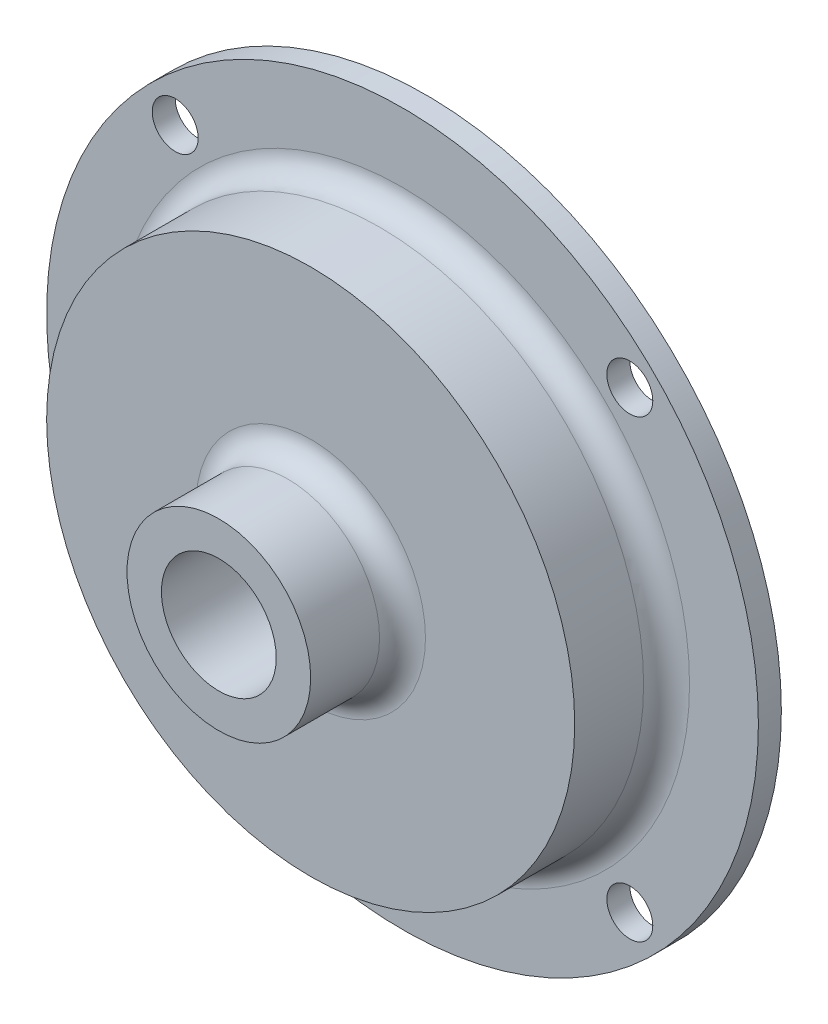
ISO-10303-21;
HEADER;
FILE_DESCRIPTION(('STEP AP214'),'2;1');
FILE_NAME('part.step','',(''),(''),'','','');
FILE_SCHEMA(('AUTOMOTIVE_DESIGN { 1 0 10303 214 1 1 1 1 }'));
ENDSEC;
DATA;
#1=APPLICATION_CONTEXT('core data for automotive mechanical design processes');
#2=APPLICATION_PROTOCOL_DEFINITION('international standard','automotive_design',2000,#1);
#3=PRODUCT_CONTEXT('',#1,'mechanical');
#4=PRODUCT('Part','Part','',(#3));
#5=PRODUCT_RELATED_PRODUCT_CATEGORY('part','',(#4));
#6=PRODUCT_DEFINITION_FORMATION('','',#4);
#7=PRODUCT_DEFINITION_CONTEXT('part definition',#1,'design');
#8=PRODUCT_DEFINITION('design','',#6,#7);
#9=PRODUCT_DEFINITION_SHAPE('','',#8);
#10=(LENGTH_UNIT() NAMED_UNIT(*) SI_UNIT(.MILLI.,.METRE.));
#11=(NAMED_UNIT(*) PLANE_ANGLE_UNIT() SI_UNIT($,.RADIAN.));
#12=(NAMED_UNIT(*) SI_UNIT($,.STERADIAN.) SOLID_ANGLE_UNIT());
#13=UNCERTAINTY_MEASURE_WITH_UNIT(LENGTH_MEASURE(1.E-05),#10,'distance_accuracy_value','');
#14=(GEOMETRIC_REPRESENTATION_CONTEXT(3) GLOBAL_UNCERTAINTY_ASSIGNED_CONTEXT((#13)) GLOBAL_UNIT_ASSIGNED_CONTEXT((#10,
#11,#12)) REPRESENTATION_CONTEXT('',''));
#15=CARTESIAN_POINT('',(0.,0.,0.));
#16=DIRECTION('',(0.,0.,1.));
#17=DIRECTION('',(1.,0.,0.));
#18=AXIS2_PLACEMENT_3D('',#15,#16,#17);
#19=CARTESIAN_POINT('',(0.,0.,15.875));
#20=DIRECTION('',(0.,0.,1.));
#21=DIRECTION('',(1.,0.,0.));
#22=AXIS2_PLACEMENT_3D('',#19,#20,#21);
#23=PLANE('',#22);
#24=CARTESIAN_POINT('',(0.,0.,15.875));
#25=DIRECTION('',(0.,0.,1.));
#26=DIRECTION('',(1.,0.,0.));
#27=AXIS2_PLACEMENT_3D('',#24,#25,#26);
#28=CIRCLE('',#27,15.875);
#29=CARTESIAN_POINT('',(15.875,0.,15.875));
#30=VERTEX_POINT('',#29);
#31=EDGE_CURVE('E45',#30,#30,#28,.F.);
#32=ORIENTED_EDGE('',*,*,#31,.T.);
#33=EDGE_LOOP('',(#32));
#34=FACE_BOUND('',#33,.T.);
#35=CARTESIAN_POINT('',(0.,0.,15.875));
#36=DIRECTION('',(0.,0.,1.));
#37=DIRECTION('',(1.,0.,0.));
#38=AXIS2_PLACEMENT_3D('',#35,#36,#37);
#39=CIRCLE('',#38,36.5125);
#40=CARTESIAN_POINT('',(36.5125,0.,15.875));
#41=VERTEX_POINT('',#40);
#42=EDGE_CURVE('E82',#41,#41,#39,.T.);
#43=ORIENTED_EDGE('',*,*,#42,.T.);
#44=EDGE_LOOP('',(#43));
#45=FACE_BOUND('',#44,.T.);
#46=ADVANCED_FACE('F34',(#34,#45),#23,.T.);
#47=CARTESIAN_POINT('',(0.,0.,3.175));
#48=DIRECTION('',(0.,0.,1.));
#49=DIRECTION('',(1.,0.,0.));
#50=AXIS2_PLACEMENT_3D('',#47,#48,#49);
#51=PLANE('',#50);
#52=CARTESIAN_POINT('',(0.,0.,3.175));
#53=DIRECTION('',(0.,0.,1.));
#54=DIRECTION('',(1.,0.,0.));
#55=AXIS2_PLACEMENT_3D('',#52,#53,#54);
#56=CIRCLE('',#55,39.6875);
#57=CARTESIAN_POINT('',(39.6875,0.,3.175));
#58=VERTEX_POINT('',#57);
#59=EDGE_CURVE('E10',#58,#58,#56,.F.);
#60=ORIENTED_EDGE('',*,*,#59,.T.);
#61=EDGE_LOOP('',(#60));
#62=FACE_BOUND('',#61,.T.);
#63=CARTESIAN_POINT('',(-31.4308964237421,31.430896423742,3.175));
#64=DIRECTION('',(0.,0.,1.));
#65=DIRECTION('',(1.,0.,0.));
#66=AXIS2_PLACEMENT_3D('',#63,#64,#65);
#67=CIRCLE('',#66,3.17500000000003);
#68=CARTESIAN_POINT('',(-28.2558964237421,31.430896423742,3.175));
#69=VERTEX_POINT('',#68);
#70=EDGE_CURVE('E76',#69,#69,#67,.T.);
#71=ORIENTED_EDGE('',*,*,#70,.F.);
#72=EDGE_LOOP('',(#71));
#73=FACE_BOUND('',#72,.T.);
#74=CARTESIAN_POINT('',(-31.430896423742,-31.4308964237421,3.175));
#75=DIRECTION('',(0.,0.,1.));
#76=DIRECTION('',(1.,0.,0.));
#77=AXIS2_PLACEMENT_3D('',#74,#75,#76);
#78=CIRCLE('',#77,3.17500000000001);
#79=CARTESIAN_POINT('',(-28.255896423742,-31.4308964237421,3.175));
#80=VERTEX_POINT('',#79);
#81=EDGE_CURVE('E64',#80,#80,#78,.T.);
#82=ORIENTED_EDGE('',*,*,#81,.F.);
#83=EDGE_LOOP('',(#82));
#84=FACE_BOUND('',#83,.T.);
#85=CARTESIAN_POINT('',(0.,0.,3.175));
#86=DIRECTION('',(0.,0.,1.));
#87=DIRECTION('',(1.,0.,0.));
#88=AXIS2_PLACEMENT_3D('',#85,#86,#87);
#89=CIRCLE('',#88,49.2125);
#90=CARTESIAN_POINT('',(49.2125,0.,3.175));
#91=VERTEX_POINT('',#90);
#92=EDGE_CURVE('E54',#91,#91,#89,.T.);
#93=ORIENTED_EDGE('',*,*,#92,.T.);
#94=EDGE_LOOP('',(#93));
#95=FACE_BOUND('',#94,.T.);
#96=CARTESIAN_POINT('',(31.430896423742,31.4308964237421,3.175));
#97=DIRECTION('',(0.,0.,1.));
#98=DIRECTION('',(1.,0.,0.));
#99=AXIS2_PLACEMENT_3D('',#96,#97,#98);
#100=CIRCLE('',#99,3.17500000000001);
#101=CARTESIAN_POINT('',(34.605896423742,31.4308964237421,3.175));
#102=VERTEX_POINT('',#101);
#103=EDGE_CURVE('E58',#102,#102,#100,.T.);
#104=ORIENTED_EDGE('',*,*,#103,.F.);
#105=EDGE_LOOP('',(#104));
#106=FACE_BOUND('',#105,.T.);
#107=CARTESIAN_POINT('',(31.4308964237421,-31.430896423742,3.175));
#108=DIRECTION('',(0.,0.,1.));
#109=DIRECTION('',(1.,0.,0.));
#110=AXIS2_PLACEMENT_3D('',#107,#108,#109);
#111=CIRCLE('',#110,3.17500000000001);
#112=CARTESIAN_POINT('',(34.6058964237421,-31.430896423742,3.175));
#113=VERTEX_POINT('',#112);
#114=EDGE_CURVE('E70',#113,#113,#111,.T.);
#115=ORIENTED_EDGE('',*,*,#114,.F.);
#116=EDGE_LOOP('',(#115));
#117=FACE_BOUND('',#116,.T.);
#118=ADVANCED_FACE('F125',(#62,#73,#84,#95,#106,#117),#51,.T.);
#119=CARTESIAN_POINT('',(0.,0.,0.));
#120=DIRECTION('',(0.,0.,1.));
#121=DIRECTION('',(1.,0.,0.));
#122=AXIS2_PLACEMENT_3D('',#119,#120,#121);
#123=PLANE('',#122);
#124=CARTESIAN_POINT('',(0.,0.,0.));
#125=DIRECTION('',(0.,0.,1.));
#126=DIRECTION('',(1.,0.,0.));
#127=AXIS2_PLACEMENT_3D('',#124,#125,#126);
#128=CIRCLE('',#127,7.9375);
#129=CARTESIAN_POINT('',(7.9375,0.,0.));
#130=VERTEX_POINT('',#129);
#131=EDGE_CURVE('E90',#130,#130,#128,.T.);
#132=ORIENTED_EDGE('',*,*,#131,.T.);
#133=EDGE_LOOP('',(#132));
#134=FACE_BOUND('',#133,.T.);
#135=CARTESIAN_POINT('',(31.4308964237421,-31.430896423742,0.));
#136=DIRECTION('',(0.,0.,1.));
#137=DIRECTION('',(1.,0.,0.));
#138=AXIS2_PLACEMENT_3D('',#135,#136,#137);
#139=CIRCLE('',#138,3.17500000000001);
#140=CARTESIAN_POINT('',(34.6058964237421,-31.430896423742,0.));
#141=VERTEX_POINT('',#140);
#142=EDGE_CURVE('E73',#141,#141,#139,.T.);
#143=ORIENTED_EDGE('',*,*,#142,.T.);
#144=EDGE_LOOP('',(#143));
#145=FACE_BOUND('',#144,.T.);
#146=CARTESIAN_POINT('',(31.430896423742,31.4308964237421,0.));
#147=DIRECTION('',(0.,0.,1.));
#148=DIRECTION('',(1.,0.,0.));
#149=AXIS2_PLACEMENT_3D('',#146,#147,#148);
#150=CIRCLE('',#149,3.17500000000001);
#151=CARTESIAN_POINT('',(34.605896423742,31.4308964237421,0.));
#152=VERTEX_POINT('',#151);
#153=EDGE_CURVE('E61',#152,#152,#150,.T.);
#154=ORIENTED_EDGE('',*,*,#153,.T.);
#155=EDGE_LOOP('',(#154));
#156=FACE_BOUND('',#155,.T.);
#157=CARTESIAN_POINT('',(0.,0.,0.));
#158=DIRECTION('',(0.,0.,1.));
#159=DIRECTION('',(1.,0.,0.));
#160=AXIS2_PLACEMENT_3D('',#157,#158,#159);
#161=CIRCLE('',#160,49.2125);
#162=CARTESIAN_POINT('',(49.2125,0.,0.));
#163=VERTEX_POINT('',#162);
#164=EDGE_CURVE('E55',#163,#163,#161,.T.);
#165=ORIENTED_EDGE('',*,*,#164,.F.);
#166=EDGE_LOOP('',(#165));
#167=FACE_BOUND('',#166,.T.);
#168=CARTESIAN_POINT('',(-31.430896423742,-31.4308964237421,0.));
#169=DIRECTION('',(0.,0.,1.));
#170=DIRECTION('',(1.,0.,0.));
#171=AXIS2_PLACEMENT_3D('',#168,#169,#170);
#172=CIRCLE('',#171,3.17500000000001);
#173=CARTESIAN_POINT('',(-28.255896423742,-31.4308964237421,0.));
#174=VERTEX_POINT('',#173);
#175=EDGE_CURVE('E67',#174,#174,#172,.T.);
#176=ORIENTED_EDGE('',*,*,#175,.T.);
#177=EDGE_LOOP('',(#176));
#178=FACE_BOUND('',#177,.T.);
#179=CARTESIAN_POINT('',(-31.4308964237421,31.430896423742,0.));
#180=DIRECTION('',(0.,0.,1.));
#181=DIRECTION('',(1.,0.,0.));
#182=AXIS2_PLACEMENT_3D('',#179,#180,#181);
#183=CIRCLE('',#182,3.17500000000003);
#184=CARTESIAN_POINT('',(-28.2558964237421,31.430896423742,0.));
#185=VERTEX_POINT('',#184);
#186=EDGE_CURVE('E79',#185,#185,#183,.T.);
#187=ORIENTED_EDGE('',*,*,#186,.T.);
#188=EDGE_LOOP('',(#187));
#189=FACE_BOUND('',#188,.T.);
#190=ADVANCED_FACE('F97',(#134,#145,#156,#167,#178,#189),#123,.F.);
#191=CARTESIAN_POINT('',(0.,0.,3.175));
#192=DIRECTION('',(0.,0.,-1.));
#193=DIRECTION('',(-1.,0.,0.));
#194=AXIS2_PLACEMENT_3D('',#191,#192,#193);
#195=CYLINDRICAL_SURFACE('',#194,49.2125);
#196=ORIENTED_EDGE('',*,*,#92,.F.);
#197=EDGE_LOOP('',(#196));
#198=FACE_BOUND('',#197,.T.);
#199=ORIENTED_EDGE('',*,*,#164,.T.);
#200=EDGE_LOOP('',(#199));
#201=FACE_BOUND('',#200,.T.);
#202=ADVANCED_FACE('F146',(#198,#201),#195,.T.);
#203=CARTESIAN_POINT('',(31.430896423742,31.4308964237421,3.175));
#204=DIRECTION('',(0.,0.,-1.));
#205=DIRECTION('',(-1.,0.,0.));
#206=AXIS2_PLACEMENT_3D('',#203,#204,#205);
#207=CYLINDRICAL_SURFACE('',#206,3.17500000000001);
#208=ORIENTED_EDGE('',*,*,#103,.T.);
#209=EDGE_LOOP('',(#208));
#210=FACE_BOUND('',#209,.T.);
#211=ORIENTED_EDGE('',*,*,#153,.F.);
#212=EDGE_LOOP('',(#211));
#213=FACE_BOUND('',#212,.T.);
#214=ADVANCED_FACE('F143',(#210,#213),#207,.F.);
#215=CARTESIAN_POINT('',(-31.430896423742,-31.4308964237421,3.175));
#216=DIRECTION('',(0.,0.,-1.));
#217=DIRECTION('',(-1.,0.,0.));
#218=AXIS2_PLACEMENT_3D('',#215,#216,#217);
#219=CYLINDRICAL_SURFACE('',#218,3.17500000000001);
#220=ORIENTED_EDGE('',*,*,#81,.T.);
#221=EDGE_LOOP('',(#220));
#222=FACE_BOUND('',#221,.T.);
#223=ORIENTED_EDGE('',*,*,#175,.F.);
#224=EDGE_LOOP('',(#223));
#225=FACE_BOUND('',#224,.T.);
#226=ADVANCED_FACE('F139',(#222,#225),#219,.F.);
#227=CARTESIAN_POINT('',(31.4308964237421,-31.430896423742,3.175));
#228=DIRECTION('',(0.,0.,-1.));
#229=DIRECTION('',(-1.,0.,0.));
#230=AXIS2_PLACEMENT_3D('',#227,#228,#229);
#231=CYLINDRICAL_SURFACE('',#230,3.17500000000001);
#232=ORIENTED_EDGE('',*,*,#114,.T.);
#233=EDGE_LOOP('',(#232));
#234=FACE_BOUND('',#233,.T.);
#235=ORIENTED_EDGE('',*,*,#142,.F.);
#236=EDGE_LOOP('',(#235));
#237=FACE_BOUND('',#236,.T.);
#238=ADVANCED_FACE('F135',(#234,#237),#231,.F.);
#239=CARTESIAN_POINT('',(-31.4308964237421,31.430896423742,3.175));
#240=DIRECTION('',(0.,0.,-1.));
#241=DIRECTION('',(-1.,0.,0.));
#242=AXIS2_PLACEMENT_3D('',#239,#240,#241);
#243=CYLINDRICAL_SURFACE('',#242,3.17500000000003);
#244=ORIENTED_EDGE('',*,*,#70,.T.);
#245=EDGE_LOOP('',(#244));
#246=FACE_BOUND('',#245,.T.);
#247=ORIENTED_EDGE('',*,*,#186,.F.);
#248=EDGE_LOOP('',(#247));
#249=FACE_BOUND('',#248,.T.);
#250=ADVANCED_FACE('F121',(#246,#249),#243,.F.);
#251=CARTESIAN_POINT('',(0.,0.,15.875));
#252=DIRECTION('',(0.,0.,-1.));
#253=DIRECTION('',(-1.,0.,0.));
#254=AXIS2_PLACEMENT_3D('',#251,#252,#253);
#255=CYLINDRICAL_SURFACE('',#254,36.5125);
#256=CARTESIAN_POINT('',(0.,0.,6.35));
#257=DIRECTION('',(0.,0.,1.));
#258=DIRECTION('',(1.,0.,0.));
#259=AXIS2_PLACEMENT_3D('',#256,#257,#258);
#260=CIRCLE('',#259,36.5125);
#261=CARTESIAN_POINT('',(36.5125,0.,6.35));
#262=VERTEX_POINT('',#261);
#263=EDGE_CURVE('E41',#262,#262,#260,.T.);
#264=ORIENTED_EDGE('',*,*,#263,.T.);
#265=EDGE_LOOP('',(#264));
#266=FACE_BOUND('',#265,.T.);
#267=ORIENTED_EDGE('',*,*,#42,.F.);
#268=EDGE_LOOP('',(#267));
#269=FACE_BOUND('',#268,.T.);
#270=ADVANCED_FACE('F115',(#266,#269),#255,.T.);
#271=CARTESIAN_POINT('',(0.,0.,28.575));
#272=DIRECTION('',(0.,0.,-1.));
#273=DIRECTION('',(-1.,0.,0.));
#274=AXIS2_PLACEMENT_3D('',#271,#272,#273);
#275=CYLINDRICAL_SURFACE('',#274,12.7);
#276=CARTESIAN_POINT('',(0.,0.,19.05));
#277=DIRECTION('',(0.,0.,1.));
#278=DIRECTION('',(1.,0.,0.));
#279=AXIS2_PLACEMENT_3D('',#276,#277,#278);
#280=CIRCLE('',#279,12.7);
#281=CARTESIAN_POINT('',(12.7,0.,19.05));
#282=VERTEX_POINT('',#281);
#283=EDGE_CURVE('E49',#282,#282,#280,.T.);
#284=ORIENTED_EDGE('',*,*,#283,.T.);
#285=EDGE_LOOP('',(#284));
#286=FACE_BOUND('',#285,.T.);
#287=CARTESIAN_POINT('',(0.,0.,28.575));
#288=DIRECTION('',(0.,0.,1.));
#289=DIRECTION('',(1.,0.,0.));
#290=AXIS2_PLACEMENT_3D('',#287,#288,#289);
#291=CIRCLE('',#290,12.7);
#292=CARTESIAN_POINT('',(12.7,0.,28.575));
#293=VERTEX_POINT('',#292);
#294=EDGE_CURVE('E87',#293,#293,#291,.T.);
#295=ORIENTED_EDGE('',*,*,#294,.F.);
#296=EDGE_LOOP('',(#295));
#297=FACE_BOUND('',#296,.T.);
#298=ADVANCED_FACE('F110',(#286,#297),#275,.T.);
#299=CARTESIAN_POINT('',(0.,0.,28.575));
#300=DIRECTION('',(0.,0.,1.));
#301=DIRECTION('',(1.,0.,0.));
#302=AXIS2_PLACEMENT_3D('',#299,#300,#301);
#303=PLANE('',#302);
#304=CARTESIAN_POINT('',(0.,0.,28.575));
#305=DIRECTION('',(0.,0.,1.));
#306=DIRECTION('',(1.,0.,0.));
#307=AXIS2_PLACEMENT_3D('',#304,#305,#306);
#308=CIRCLE('',#307,7.9375);
#309=CARTESIAN_POINT('',(7.9375,0.,28.575));
#310=VERTEX_POINT('',#309);
#311=EDGE_CURVE('E91',#310,#310,#308,.T.);
#312=ORIENTED_EDGE('',*,*,#311,.F.);
#313=EDGE_LOOP('',(#312));
#314=FACE_BOUND('',#313,.T.);
#315=ORIENTED_EDGE('',*,*,#294,.T.);
#316=EDGE_LOOP('',(#315));
#317=FACE_BOUND('',#316,.T.);
#318=ADVANCED_FACE('F106',(#314,#317),#303,.T.);
#319=CARTESIAN_POINT('',(0.,0.,19.05));
#320=DIRECTION('',(0.,0.,1.));
#321=DIRECTION('',(1.,0.,0.));
#322=AXIS2_PLACEMENT_3D('',#319,#320,#321);
#323=TOROIDAL_SURFACE('',#322,15.875,3.175);
#324=ORIENTED_EDGE('',*,*,#31,.F.);
#325=EDGE_LOOP('',(#324));
#326=FACE_BOUND('',#325,.T.);
#327=ORIENTED_EDGE('',*,*,#283,.F.);
#328=EDGE_LOOP('',(#327));
#329=FACE_BOUND('',#328,.T.);
#330=ADVANCED_FACE('F109',(#326,#329),#323,.F.);
#331=CARTESIAN_POINT('',(0.,0.,6.35));
#332=DIRECTION('',(0.,0.,1.));
#333=DIRECTION('',(1.,0.,0.));
#334=AXIS2_PLACEMENT_3D('',#331,#332,#333);
#335=TOROIDAL_SURFACE('',#334,39.6875,3.175);
#336=ORIENTED_EDGE('',*,*,#59,.F.);
#337=EDGE_LOOP('',(#336));
#338=FACE_BOUND('',#337,.T.);
#339=ORIENTED_EDGE('',*,*,#263,.F.);
#340=EDGE_LOOP('',(#339));
#341=FACE_BOUND('',#340,.T.);
#342=ADVANCED_FACE('F36',(#338,#341),#335,.F.);
#343=CARTESIAN_POINT('',(0.,0.,0.));
#344=DIRECTION('',(0.,0.,1.));
#345=DIRECTION('',(1.,0.,0.));
#346=AXIS2_PLACEMENT_3D('',#343,#344,#345);
#347=CYLINDRICAL_SURFACE('',#346,7.9375);
#348=ORIENTED_EDGE('',*,*,#131,.F.);
#349=EDGE_LOOP('',(#348));
#350=FACE_BOUND('',#349,.T.);
#351=ORIENTED_EDGE('',*,*,#311,.T.);
#352=EDGE_LOOP('',(#351));
#353=FACE_BOUND('',#352,.T.);
#354=ADVANCED_FACE('F100',(#350,#353),#347,.F.);
#355=CLOSED_SHELL('',(#46,#118,#190,#202,#214,#226,#238,#250,#270,#298,#318,#330,#342,#354));
#356=MANIFOLD_SOLID_BREP('B2',#355);
#357=ADVANCED_BREP_SHAPE_REPRESENTATION('',(#18,#356),#14);
#358=SHAPE_DEFINITION_REPRESENTATION(#9,#357);
ENDSEC;
END-ISO-10303-21;
